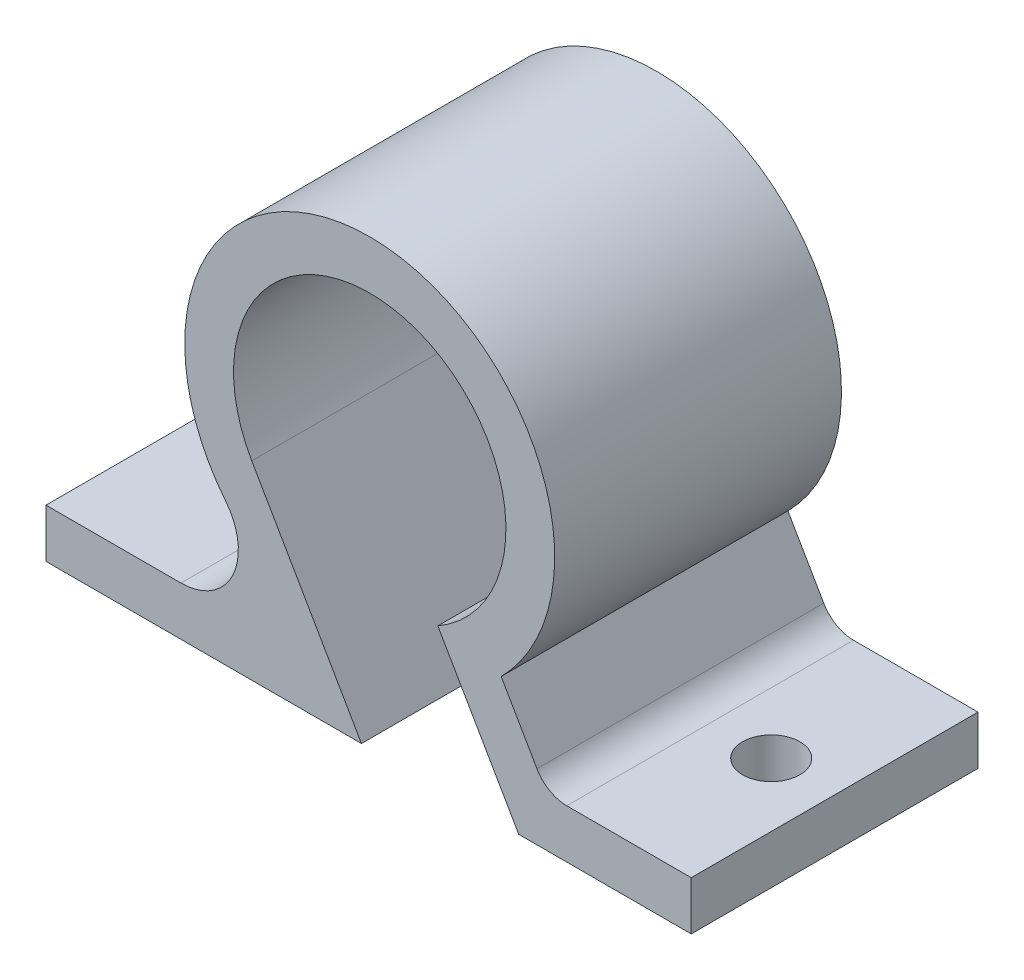
ISO-10303-21;
HEADER;
FILE_DESCRIPTION(('STEP AP214'),'2;1');
FILE_NAME('part.step','',(''),(''),'','','');
FILE_SCHEMA(('AUTOMOTIVE_DESIGN { 1 0 10303 214 1 1 1 1 }'));
ENDSEC;
DATA;
#1=APPLICATION_CONTEXT('core data for automotive mechanical design processes');
#2=APPLICATION_PROTOCOL_DEFINITION('international standard','automotive_design',2000,#1);
#3=PRODUCT_CONTEXT('',#1,'mechanical');
#4=PRODUCT('Part','Part','',(#3));
#5=PRODUCT_RELATED_PRODUCT_CATEGORY('part','',(#4));
#6=PRODUCT_DEFINITION_FORMATION('','',#4);
#7=PRODUCT_DEFINITION_CONTEXT('part definition',#1,'design');
#8=PRODUCT_DEFINITION('design','',#6,#7);
#9=PRODUCT_DEFINITION_SHAPE('','',#8);
#10=(LENGTH_UNIT() NAMED_UNIT(*) SI_UNIT(.MILLI.,.METRE.));
#11=(NAMED_UNIT(*) PLANE_ANGLE_UNIT() SI_UNIT($,.RADIAN.));
#12=(NAMED_UNIT(*) SI_UNIT($,.STERADIAN.) SOLID_ANGLE_UNIT());
#13=UNCERTAINTY_MEASURE_WITH_UNIT(LENGTH_MEASURE(1.E-05),#10,'distance_accuracy_value','');
#14=(GEOMETRIC_REPRESENTATION_CONTEXT(3) GLOBAL_UNCERTAINTY_ASSIGNED_CONTEXT((#13)) GLOBAL_UNIT_ASSIGNED_CONTEXT((#10,
#11,#12)) REPRESENTATION_CONTEXT('',''));
#15=CARTESIAN_POINT('',(0.,0.,0.));
#16=DIRECTION('',(0.,0.,1.));
#17=DIRECTION('',(1.,0.,0.));
#18=AXIS2_PLACEMENT_3D('',#15,#16,#17);
#19=CARTESIAN_POINT('',(-65.8122329054409,-53.,50.));
#20=DIRECTION('',(0.,0.,-1.));
#21=DIRECTION('',(-1.,0.,0.));
#22=AXIS2_PLACEMENT_3D('',#19,#20,#21);
#23=CYLINDRICAL_SURFACE('',#22,20.);
#24=CARTESIAN_POINT('',(-65.8122329054409,-53.,-50.));
#25=DIRECTION('',(0.,0.,-1.));
#26=DIRECTION('',(-1.,0.,0.));
#27=AXIS2_PLACEMENT_3D('',#24,#25,#26);
#28=CIRCLE('',#27,20.);
#29=CARTESIAN_POINT('',(-50.235373046165,-40.4556213017751,-50.));
#30=VERTEX_POINT('',#29);
#31=CARTESIAN_POINT('',(-65.8122329054409,-73.,-50.));
#32=VERTEX_POINT('',#31);
#33=EDGE_CURVE('E161',#30,#32,#28,.T.);
#34=ORIENTED_EDGE('',*,*,#33,.T.);
#35=DIRECTION('',(0.,0.,-1.));
#36=VECTOR('',#35,1.);
#37=CARTESIAN_POINT('',(-65.8122329054409,-73.,50.));
#38=LINE('',#37,#36);
#39=CARTESIAN_POINT('',(-65.8122329054409,-73.,50.));
#40=VERTEX_POINT('',#39);
#41=EDGE_CURVE('E11',#40,#32,#38,.T.);
#42=ORIENTED_EDGE('',*,*,#41,.F.);
#43=CARTESIAN_POINT('',(-65.8122329054409,-53.,50.));
#44=DIRECTION('',(0.,0.,-1.));
#45=DIRECTION('',(-1.,0.,0.));
#46=AXIS2_PLACEMENT_3D('',#43,#44,#45);
#47=CIRCLE('',#46,20.);
#48=CARTESIAN_POINT('',(-50.235373046165,-40.4556213017751,50.));
#49=VERTEX_POINT('',#48);
#50=EDGE_CURVE('E189',#49,#40,#47,.T.);
#51=ORIENTED_EDGE('',*,*,#50,.F.);
#52=DIRECTION('',(0.,0.,-1.));
#53=VECTOR('',#52,1.);
#54=CARTESIAN_POINT('',(-50.235373046165,-40.4556213017751,50.));
#55=LINE('',#54,#53);
#56=EDGE_CURVE('E162',#49,#30,#55,.T.);
#57=ORIENTED_EDGE('',*,*,#56,.T.);
#58=EDGE_LOOP('',(#34,#42,#51,#57));
#59=FACE_BOUND('',#58,.T.);
#60=ADVANCED_FACE('F39',(#59),#23,.F.);
#61=CARTESIAN_POINT('',(-65.8122329054409,-73.,50.));
#62=DIRECTION('',(0.,-1.,0.));
#63=DIRECTION('',(1.,0.,0.));
#64=AXIS2_PLACEMENT_3D('',#61,#62,#63);
#65=PLANE('',#64);
#66=CARTESIAN_POINT('',(-90.,-73.,0.));
#67=DIRECTION('',(0.,-1.,0.));
#68=DIRECTION('',(1.,0.,0.));
#69=AXIS2_PLACEMENT_3D('',#66,#67,#68);
#70=CIRCLE('',#69,9.99999999999999);
#71=CARTESIAN_POINT('',(-90.,-73.,-9.99999999999999));
#72=VERTEX_POINT('',#71);
#73=EDGE_CURVE('E363',#72,#72,#70,.F.);
#74=ORIENTED_EDGE('',*,*,#73,.F.);
#75=EDGE_LOOP('',(#74));
#76=FACE_BOUND('',#75,.T.);
#77=DIRECTION('',(-1.,0.,0.));
#78=VECTOR('',#77,1.);
#79=CARTESIAN_POINT('',(-65.8122329054409,-73.,-50.));
#80=LINE('',#79,#78);
#81=CARTESIAN_POINT('',(-112.886751345948,-73.,-50.));
#82=VERTEX_POINT('',#81);
#83=EDGE_CURVE('E166',#32,#82,#80,.T.);
#84=ORIENTED_EDGE('',*,*,#83,.T.);
#85=DIRECTION('',(0.,0.,-1.));
#86=VECTOR('',#85,1.);
#87=CARTESIAN_POINT('',(-112.886751345948,-73.,50.));
#88=LINE('',#87,#86);
#89=CARTESIAN_POINT('',(-112.886751345948,-73.,50.));
#90=VERTEX_POINT('',#89);
#91=EDGE_CURVE('E50',#90,#82,#88,.T.);
#92=ORIENTED_EDGE('',*,*,#91,.F.);
#93=DIRECTION('',(-1.,0.,0.));
#94=VECTOR('',#93,1.);
#95=CARTESIAN_POINT('',(-65.8122329054409,-73.,50.));
#96=LINE('',#95,#94);
#97=EDGE_CURVE('E111',#40,#90,#96,.T.);
#98=ORIENTED_EDGE('',*,*,#97,.F.);
#99=ORIENTED_EDGE('',*,*,#41,.T.);
#100=EDGE_LOOP('',(#84,#92,#98,#99));
#101=FACE_BOUND('',#100,.T.);
#102=ADVANCED_FACE('F273',(#76,#101),#65,.F.);
#103=CARTESIAN_POINT('',(-112.886751345948,-73.,50.));
#104=DIRECTION('',(1.,0.,0.));
#105=DIRECTION('',(0.,0.,-1.));
#106=AXIS2_PLACEMENT_3D('',#103,#104,#105);
#107=PLANE('',#106);
#108=DIRECTION('',(0.,-1.,0.));
#109=VECTOR('',#108,1.);
#110=CARTESIAN_POINT('',(-112.886751345948,-73.,-50.));
#111=LINE('',#110,#109);
#112=CARTESIAN_POINT('',(-112.886751345948,-90.,-50.));
#113=VERTEX_POINT('',#112);
#114=EDGE_CURVE('E173',#82,#113,#111,.T.);
#115=ORIENTED_EDGE('',*,*,#114,.T.);
#116=DIRECTION('',(0.,0.,-1.));
#117=VECTOR('',#116,1.);
#118=CARTESIAN_POINT('',(-112.886751345948,-90.,50.));
#119=LINE('',#118,#117);
#120=CARTESIAN_POINT('',(-112.886751345948,-90.,50.));
#121=VERTEX_POINT('',#120);
#122=EDGE_CURVE('E212',#121,#113,#119,.T.);
#123=ORIENTED_EDGE('',*,*,#122,.F.);
#124=DIRECTION('',(0.,-1.,0.));
#125=VECTOR('',#124,1.);
#126=CARTESIAN_POINT('',(-112.886751345948,-73.,50.));
#127=LINE('',#126,#125);
#128=EDGE_CURVE('E217',#90,#121,#127,.T.);
#129=ORIENTED_EDGE('',*,*,#128,.F.);
#130=ORIENTED_EDGE('',*,*,#91,.T.);
#131=EDGE_LOOP('',(#115,#123,#129,#130));
#132=FACE_BOUND('',#131,.T.);
#133=ADVANCED_FACE('F216',(#132),#107,.F.);
#134=CARTESIAN_POINT('',(-112.886751345948,-90.,50.));
#135=DIRECTION('',(0.,1.,0.));
#136=DIRECTION('',(0.,0.,1.));
#137=AXIS2_PLACEMENT_3D('',#134,#135,#136);
#138=PLANE('',#137);
#139=CARTESIAN_POINT('',(-90.,-90.,0.));
#140=DIRECTION('',(0.,-1.,0.));
#141=DIRECTION('',(0.,0.,1.));
#142=AXIS2_PLACEMENT_3D('',#139,#140,#141);
#143=CIRCLE('',#142,9.99999999999999);
#144=CARTESIAN_POINT('',(-90.,-90.,-9.99999999999999));
#145=VERTEX_POINT('',#144);
#146=EDGE_CURVE('E361',#145,#145,#143,.T.);
#147=ORIENTED_EDGE('',*,*,#146,.F.);
#148=EDGE_LOOP('',(#147));
#149=FACE_BOUND('',#148,.T.);
#150=DIRECTION('',(1.,0.,0.));
#151=VECTOR('',#150,1.);
#152=CARTESIAN_POINT('',(-112.886751345948,-90.,-50.));
#153=LINE('',#152,#151);
#154=CARTESIAN_POINT('',(-2.88675134594834,-90.,-50.));
#155=VERTEX_POINT('',#154);
#156=EDGE_CURVE('E171',#113,#155,#153,.T.);
#157=ORIENTED_EDGE('',*,*,#156,.T.);
#158=DIRECTION('',(0.,0.,-1.));
#159=VECTOR('',#158,1.);
#160=CARTESIAN_POINT('',(-2.88675134594834,-90.,50.));
#161=LINE('',#160,#159);
#162=CARTESIAN_POINT('',(-2.88675134594834,-90.,50.));
#163=VERTEX_POINT('',#162);
#164=EDGE_CURVE('E209',#163,#155,#161,.T.);
#165=ORIENTED_EDGE('',*,*,#164,.F.);
#166=DIRECTION('',(1.,0.,0.));
#167=VECTOR('',#166,1.);
#168=CARTESIAN_POINT('',(-112.886751345948,-90.,50.));
#169=LINE('',#168,#167);
#170=EDGE_CURVE('E239',#121,#163,#169,.T.);
#171=ORIENTED_EDGE('',*,*,#170,.F.);
#172=ORIENTED_EDGE('',*,*,#122,.T.);
#173=EDGE_LOOP('',(#157,#165,#171,#172));
#174=FACE_BOUND('',#173,.T.);
#175=ADVANCED_FACE('F227',(#149,#174),#138,.F.);
#176=CARTESIAN_POINT('',(-41.1362066797609,-23.7499999999999,50.));
#177=DIRECTION('',(-0.86602540378444,-0.499999999999998,0.));
#178=DIRECTION('',(0.499999999999998,-0.86602540378444,0.));
#179=AXIS2_PLACEMENT_3D('',#176,#177,#178);
#180=PLANE('',#179);
#181=DIRECTION('',(-0.499999999999998,0.86602540378444,0.));
#182=VECTOR('',#181,1.);
#183=CARTESIAN_POINT('',(-41.1362066797609,-23.7499999999999,-50.));
#184=LINE('',#183,#182);
#185=CARTESIAN_POINT('',(-41.1362066797609,-23.7499999999999,-50.));
#186=VERTEX_POINT('',#185);
#187=EDGE_CURVE('E172',#155,#186,#184,.T.);
#188=ORIENTED_EDGE('',*,*,#187,.T.);
#189=DIRECTION('',(0.,0.,-1.));
#190=VECTOR('',#189,1.);
#191=CARTESIAN_POINT('',(-41.1362066797609,-23.7499999999999,50.));
#192=LINE('',#191,#190);
#193=CARTESIAN_POINT('',(-41.1362066797609,-23.7499999999999,50.));
#194=VERTEX_POINT('',#193);
#195=EDGE_CURVE('E207',#194,#186,#192,.T.);
#196=ORIENTED_EDGE('',*,*,#195,.F.);
#197=DIRECTION('',(-0.499999999999998,0.86602540378444,0.));
#198=VECTOR('',#197,1.);
#199=CARTESIAN_POINT('',(-41.1362066797609,-23.7499999999999,50.));
#200=LINE('',#199,#198);
#201=EDGE_CURVE('E234',#163,#194,#200,.T.);
#202=ORIENTED_EDGE('',*,*,#201,.F.);
#203=ORIENTED_EDGE('',*,*,#164,.T.);
#204=EDGE_LOOP('',(#188,#196,#202,#203));
#205=FACE_BOUND('',#204,.T.);
#206=ADVANCED_FACE('F232',(#205),#180,.F.);
#207=CARTESIAN_POINT('',(0.,0.,50.));
#208=DIRECTION('',(0.,0.,-1.));
#209=DIRECTION('',(-1.,0.,0.));
#210=AXIS2_PLACEMENT_3D('',#207,#208,#209);
#211=CYLINDRICAL_SURFACE('',#210,47.5);
#212=CARTESIAN_POINT('',(0.,0.,-50.));
#213=DIRECTION('',(0.,0.,-1.));
#214=DIRECTION('',(1.,0.,0.));
#215=AXIS2_PLACEMENT_3D('',#212,#213,#214);
#216=CIRCLE('',#215,47.5);
#217=CARTESIAN_POINT('',(23.7499999999999,-41.1362066797609,-50.));
#218=VERTEX_POINT('',#217);
#219=EDGE_CURVE('E180',#186,#218,#216,.T.);
#220=ORIENTED_EDGE('',*,*,#219,.T.);
#221=DIRECTION('',(0.,0.,-1.));
#222=VECTOR('',#221,1.);
#223=CARTESIAN_POINT('',(23.7499999999999,-41.1362066797609,50.));
#224=LINE('',#223,#222);
#225=CARTESIAN_POINT('',(23.7499999999999,-41.1362066797609,50.));
#226=VERTEX_POINT('',#225);
#227=EDGE_CURVE('E201',#226,#218,#224,.T.);
#228=ORIENTED_EDGE('',*,*,#227,.F.);
#229=CARTESIAN_POINT('',(0.,0.,50.));
#230=DIRECTION('',(0.,0.,-1.));
#231=DIRECTION('',(1.,0.,0.));
#232=AXIS2_PLACEMENT_3D('',#229,#230,#231);
#233=CIRCLE('',#232,47.5);
#234=EDGE_CURVE('E240',#194,#226,#233,.T.);
#235=ORIENTED_EDGE('',*,*,#234,.F.);
#236=ORIENTED_EDGE('',*,*,#195,.T.);
#237=EDGE_LOOP('',(#220,#228,#235,#236));
#238=FACE_BOUND('',#237,.T.);
#239=ADVANCED_FACE('F286',(#238),#211,.F.);
#240=CARTESIAN_POINT('',(23.7499999999999,-41.1362066797609,50.));
#241=DIRECTION('',(0.86602540378444,0.499999999999998,0.));
#242=DIRECTION('',(-0.499999999999998,0.86602540378444,0.));
#243=AXIS2_PLACEMENT_3D('',#240,#241,#242);
#244=PLANE('',#243);
#245=DIRECTION('',(0.499999999999998,-0.86602540378444,0.));
#246=VECTOR('',#245,1.);
#247=CARTESIAN_POINT('',(23.7499999999999,-41.1362066797609,-50.));
#248=LINE('',#247,#246);
#249=CARTESIAN_POINT('',(51.961524227066,-90.,-50.));
#250=VERTEX_POINT('',#249);
#251=EDGE_CURVE('E177',#218,#250,#248,.T.);
#252=ORIENTED_EDGE('',*,*,#251,.T.);
#253=DIRECTION('',(0.,0.,-1.));
#254=VECTOR('',#253,1.);
#255=CARTESIAN_POINT('',(51.961524227066,-90.,50.));
#256=LINE('',#255,#254);
#257=CARTESIAN_POINT('',(51.961524227066,-90.,50.));
#258=VERTEX_POINT('',#257);
#259=EDGE_CURVE('E196',#258,#250,#256,.T.);
#260=ORIENTED_EDGE('',*,*,#259,.F.);
#261=DIRECTION('',(0.499999999999998,-0.86602540378444,0.));
#262=VECTOR('',#261,1.);
#263=CARTESIAN_POINT('',(23.7499999999999,-41.1362066797609,50.));
#264=LINE('',#263,#262);
#265=EDGE_CURVE('E238',#226,#258,#264,.T.);
#266=ORIENTED_EDGE('',*,*,#265,.F.);
#267=ORIENTED_EDGE('',*,*,#227,.T.);
#268=EDGE_LOOP('',(#252,#260,#266,#267));
#269=FACE_BOUND('',#268,.T.);
#270=ADVANCED_FACE('F291',(#269),#244,.F.);
#271=CARTESIAN_POINT('',(51.961524227066,-90.,50.));
#272=DIRECTION('',(0.,1.,0.));
#273=DIRECTION('',(0.,0.,1.));
#274=AXIS2_PLACEMENT_3D('',#271,#272,#273);
#275=PLANE('',#274);
#276=CARTESIAN_POINT('',(90.,-90.,0.));
#277=DIRECTION('',(0.,-1.,0.));
#278=DIRECTION('',(0.,0.,-1.));
#279=AXIS2_PLACEMENT_3D('',#276,#277,#278);
#280=CIRCLE('',#279,9.99999999999999);
#281=CARTESIAN_POINT('',(90.,-90.,-9.99999999999999));
#282=VERTEX_POINT('',#281);
#283=EDGE_CURVE('E364',#282,#282,#280,.T.);
#284=ORIENTED_EDGE('',*,*,#283,.F.);
#285=EDGE_LOOP('',(#284));
#286=FACE_BOUND('',#285,.T.);
#287=DIRECTION('',(1.,0.,0.));
#288=VECTOR('',#287,1.);
#289=CARTESIAN_POINT('',(51.961524227066,-90.,-50.));
#290=LINE('',#289,#288);
#291=CARTESIAN_POINT('',(112.113248654052,-90.,-50.));
#292=VERTEX_POINT('',#291);
#293=EDGE_CURVE('E181',#250,#292,#290,.T.);
#294=ORIENTED_EDGE('',*,*,#293,.T.);
#295=DIRECTION('',(0.,0.,-1.));
#296=VECTOR('',#295,1.);
#297=CARTESIAN_POINT('',(112.113248654052,-90.,50.));
#298=LINE('',#297,#296);
#299=CARTESIAN_POINT('',(112.113248654052,-90.,50.));
#300=VERTEX_POINT('',#299);
#301=EDGE_CURVE('E200',#300,#292,#298,.T.);
#302=ORIENTED_EDGE('',*,*,#301,.F.);
#303=DIRECTION('',(1.,0.,0.));
#304=VECTOR('',#303,1.);
#305=CARTESIAN_POINT('',(51.961524227066,-90.,50.));
#306=LINE('',#305,#304);
#307=EDGE_CURVE('E247',#258,#300,#306,.T.);
#308=ORIENTED_EDGE('',*,*,#307,.F.);
#309=ORIENTED_EDGE('',*,*,#259,.T.);
#310=EDGE_LOOP('',(#294,#302,#308,#309));
#311=FACE_BOUND('',#310,.T.);
#312=ADVANCED_FACE('F300',(#286,#311),#275,.F.);
#313=CARTESIAN_POINT('',(112.113248654052,-90.,50.));
#314=DIRECTION('',(-1.,0.,0.));
#315=DIRECTION('',(0.,-1.,0.));
#316=AXIS2_PLACEMENT_3D('',#313,#314,#315);
#317=PLANE('',#316);
#318=DIRECTION('',(0.,1.,0.));
#319=VECTOR('',#318,1.);
#320=CARTESIAN_POINT('',(112.113248654052,-90.,-50.));
#321=LINE('',#320,#319);
#322=CARTESIAN_POINT('',(112.113248654052,-73.,-50.));
#323=VERTEX_POINT('',#322);
#324=EDGE_CURVE('E183',#292,#323,#321,.T.);
#325=ORIENTED_EDGE('',*,*,#324,.T.);
#326=DIRECTION('',(0.,0.,-1.));
#327=VECTOR('',#326,1.);
#328=CARTESIAN_POINT('',(112.113248654052,-73.,50.));
#329=LINE('',#328,#327);
#330=CARTESIAN_POINT('',(112.113248654052,-73.,50.));
#331=VERTEX_POINT('',#330);
#332=EDGE_CURVE('E191',#331,#323,#329,.T.);
#333=ORIENTED_EDGE('',*,*,#332,.F.);
#334=DIRECTION('',(0.,1.,0.));
#335=VECTOR('',#334,1.);
#336=CARTESIAN_POINT('',(112.113248654052,-90.,50.));
#337=LINE('',#336,#335);
#338=EDGE_CURVE('E246',#300,#331,#337,.T.);
#339=ORIENTED_EDGE('',*,*,#338,.F.);
#340=ORIENTED_EDGE('',*,*,#301,.T.);
#341=EDGE_LOOP('',(#325,#333,#339,#340));
#342=FACE_BOUND('',#341,.T.);
#343=ADVANCED_FACE('F254',(#342),#317,.F.);
#344=CARTESIAN_POINT('',(112.113248654052,-73.,50.));
#345=DIRECTION('',(0.,-1.,0.));
#346=DIRECTION('',(1.,0.,0.));
#347=AXIS2_PLACEMENT_3D('',#344,#345,#346);
#348=PLANE('',#347);
#349=CARTESIAN_POINT('',(90.,-73.,0.));
#350=DIRECTION('',(0.,-1.,0.));
#351=DIRECTION('',(1.,0.,0.));
#352=AXIS2_PLACEMENT_3D('',#349,#350,#351);
#353=CIRCLE('',#352,9.99999999999999);
#354=CARTESIAN_POINT('',(90.,-73.,-9.99999999999999));
#355=VERTEX_POINT('',#354);
#356=EDGE_CURVE('E170',#355,#355,#353,.F.);
#357=ORIENTED_EDGE('',*,*,#356,.F.);
#358=EDGE_LOOP('',(#357));
#359=FACE_BOUND('',#358,.T.);
#360=DIRECTION('',(-1.,0.,0.));
#361=VECTOR('',#360,1.);
#362=CARTESIAN_POINT('',(112.113248654052,-73.,-50.));
#363=LINE('',#362,#361);
#364=CARTESIAN_POINT('',(68.7046820335653,-73.,-50.));
#365=VERTEX_POINT('',#364);
#366=EDGE_CURVE('E184',#323,#365,#363,.T.);
#367=ORIENTED_EDGE('',*,*,#366,.T.);
#368=DIRECTION('',(0.,0.,-1.));
#369=VECTOR('',#368,1.);
#370=CARTESIAN_POINT('',(68.7046820335653,-73.,50.));
#371=LINE('',#370,#369);
#372=CARTESIAN_POINT('',(68.7046820335653,-73.,50.));
#373=VERTEX_POINT('',#372);
#374=EDGE_CURVE('E157',#373,#365,#371,.T.);
#375=ORIENTED_EDGE('',*,*,#374,.F.);
#376=DIRECTION('',(-1.,0.,0.));
#377=VECTOR('',#376,1.);
#378=CARTESIAN_POINT('',(112.113248654052,-73.,50.));
#379=LINE('',#378,#377);
#380=EDGE_CURVE('E150',#331,#373,#379,.T.);
#381=ORIENTED_EDGE('',*,*,#380,.F.);
#382=ORIENTED_EDGE('',*,*,#332,.T.);
#383=EDGE_LOOP('',(#367,#375,#381,#382));
#384=FACE_BOUND('',#383,.T.);
#385=ADVANCED_FACE('F256',(#359,#384),#348,.F.);
#386=CARTESIAN_POINT('',(68.7046820335653,-61.,50.));
#387=DIRECTION('',(0.,0.,-1.));
#388=DIRECTION('',(-1.,0.,0.));
#389=AXIS2_PLACEMENT_3D('',#386,#387,#388);
#390=CYLINDRICAL_SURFACE('',#389,12.);
#391=CARTESIAN_POINT('',(68.7046820335653,-61.,-50.));
#392=DIRECTION('',(0.,0.,-1.));
#393=DIRECTION('',(-1.,0.,0.));
#394=AXIS2_PLACEMENT_3D('',#391,#392,#393);
#395=CIRCLE('',#394,12.);
#396=CARTESIAN_POINT('',(58.312377188152,-67.,-50.));
#397=VERTEX_POINT('',#396);
#398=EDGE_CURVE('E151',#365,#397,#395,.T.);
#399=ORIENTED_EDGE('',*,*,#398,.T.);
#400=DIRECTION('',(0.,0.,-1.));
#401=VECTOR('',#400,1.);
#402=CARTESIAN_POINT('',(58.312377188152,-67.,50.));
#403=LINE('',#402,#401);
#404=CARTESIAN_POINT('',(58.312377188152,-67.,50.));
#405=VERTEX_POINT('',#404);
#406=EDGE_CURVE('E155',#405,#397,#403,.T.);
#407=ORIENTED_EDGE('',*,*,#406,.F.);
#408=CARTESIAN_POINT('',(68.7046820335653,-61.,50.));
#409=DIRECTION('',(0.,0.,-1.));
#410=DIRECTION('',(-1.,0.,0.));
#411=AXIS2_PLACEMENT_3D('',#408,#409,#410);
#412=CIRCLE('',#411,12.);
#413=EDGE_CURVE('E141',#373,#405,#412,.T.);
#414=ORIENTED_EDGE('',*,*,#413,.F.);
#415=ORIENTED_EDGE('',*,*,#374,.T.);
#416=EDGE_LOOP('',(#399,#407,#414,#415));
#417=FACE_BOUND('',#416,.T.);
#418=ADVANCED_FACE('F153',(#417),#390,.F.);
#419=CARTESIAN_POINT('',(58.312377188152,-67.,50.));
#420=DIRECTION('',(-0.866025403784439,-0.499999999999998,0.));
#421=DIRECTION('',(0.499999999999999,-0.86602540378444,0.));
#422=AXIS2_PLACEMENT_3D('',#419,#420,#421);
#423=PLANE('',#422);
#424=DIRECTION('',(-0.499999999999998,0.866025403784439,0.));
#425=VECTOR('',#424,1.);
#426=CARTESIAN_POINT('',(58.312377188152,-67.,-50.));
#427=LINE('',#426,#425);
#428=CARTESIAN_POINT('',(45.8321168514901,-45.3835550052148,-50.));
#429=VERTEX_POINT('',#428);
#430=EDGE_CURVE('E98',#397,#429,#427,.T.);
#431=ORIENTED_EDGE('',*,*,#430,.T.);
#432=DIRECTION('',(0.,0.,-1.));
#433=VECTOR('',#432,1.);
#434=CARTESIAN_POINT('',(45.8321168514901,-45.3835550052148,50.));
#435=LINE('',#434,#433);
#436=CARTESIAN_POINT('',(45.8321168514901,-45.3835550052148,50.));
#437=VERTEX_POINT('',#436);
#438=EDGE_CURVE('E160',#437,#429,#435,.T.);
#439=ORIENTED_EDGE('',*,*,#438,.F.);
#440=DIRECTION('',(-0.499999999999998,0.866025403784439,0.));
#441=VECTOR('',#440,1.);
#442=CARTESIAN_POINT('',(58.312377188152,-67.,50.));
#443=LINE('',#442,#441);
#444=EDGE_CURVE('E144',#405,#437,#443,.T.);
#445=ORIENTED_EDGE('',*,*,#444,.F.);
#446=ORIENTED_EDGE('',*,*,#406,.T.);
#447=EDGE_LOOP('',(#431,#439,#445,#446));
#448=FACE_BOUND('',#447,.T.);
#449=ADVANCED_FACE('F159',(#448),#423,.F.);
#450=CARTESIAN_POINT('',(0.,0.,50.));
#451=DIRECTION('',(0.,0.,-1.));
#452=DIRECTION('',(-1.,0.,0.));
#453=AXIS2_PLACEMENT_3D('',#450,#451,#452);
#454=CYLINDRICAL_SURFACE('',#453,64.5);
#455=CARTESIAN_POINT('',(0.,0.,-50.));
#456=DIRECTION('',(0.,0.,1.));
#457=DIRECTION('',(1.,0.,0.));
#458=AXIS2_PLACEMENT_3D('',#455,#456,#457);
#459=CIRCLE('',#458,64.5);
#460=EDGE_CURVE('E103',#429,#30,#459,.T.);
#461=ORIENTED_EDGE('',*,*,#460,.T.);
#462=ORIENTED_EDGE('',*,*,#56,.F.);
#463=CARTESIAN_POINT('',(0.,0.,50.));
#464=DIRECTION('',(0.,0.,1.));
#465=DIRECTION('',(1.,0.,0.));
#466=AXIS2_PLACEMENT_3D('',#463,#464,#465);
#467=CIRCLE('',#466,64.5);
#468=EDGE_CURVE('E54',#437,#49,#467,.T.);
#469=ORIENTED_EDGE('',*,*,#468,.F.);
#470=ORIENTED_EDGE('',*,*,#438,.T.);
#471=EDGE_LOOP('',(#461,#462,#469,#470));
#472=FACE_BOUND('',#471,.T.);
#473=ADVANCED_FACE('F265',(#472),#454,.T.);
#474=CARTESIAN_POINT('',(-65.8122329054409,-53.,50.));
#475=DIRECTION('',(0.,0.,-1.));
#476=DIRECTION('',(-1.,0.,0.));
#477=AXIS2_PLACEMENT_3D('',#474,#475,#476);
#478=PLANE('',#477);
#479=ORIENTED_EDGE('',*,*,#50,.T.);
#480=ORIENTED_EDGE('',*,*,#97,.T.);
#481=ORIENTED_EDGE('',*,*,#128,.T.);
#482=ORIENTED_EDGE('',*,*,#170,.T.);
#483=ORIENTED_EDGE('',*,*,#201,.T.);
#484=ORIENTED_EDGE('',*,*,#234,.T.);
#485=ORIENTED_EDGE('',*,*,#265,.T.);
#486=ORIENTED_EDGE('',*,*,#307,.T.);
#487=ORIENTED_EDGE('',*,*,#338,.T.);
#488=ORIENTED_EDGE('',*,*,#380,.T.);
#489=ORIENTED_EDGE('',*,*,#413,.T.);
#490=ORIENTED_EDGE('',*,*,#444,.T.);
#491=ORIENTED_EDGE('',*,*,#468,.T.);
#492=EDGE_LOOP('',(#479,#480,#481,#482,#483,#484,#485,#486,#487,#488,#489,#490,#491));
#493=FACE_BOUND('',#492,.T.);
#494=ADVANCED_FACE('F142',(#493),#478,.F.);
#495=CARTESIAN_POINT('',(-65.8122329054409,-53.,-50.));
#496=DIRECTION('',(0.,0.,-1.));
#497=DIRECTION('',(-1.,0.,0.));
#498=AXIS2_PLACEMENT_3D('',#495,#496,#497);
#499=PLANE('',#498);
#500=ORIENTED_EDGE('',*,*,#33,.F.);
#501=ORIENTED_EDGE('',*,*,#460,.F.);
#502=ORIENTED_EDGE('',*,*,#430,.F.);
#503=ORIENTED_EDGE('',*,*,#398,.F.);
#504=ORIENTED_EDGE('',*,*,#366,.F.);
#505=ORIENTED_EDGE('',*,*,#324,.F.);
#506=ORIENTED_EDGE('',*,*,#293,.F.);
#507=ORIENTED_EDGE('',*,*,#251,.F.);
#508=ORIENTED_EDGE('',*,*,#219,.F.);
#509=ORIENTED_EDGE('',*,*,#187,.F.);
#510=ORIENTED_EDGE('',*,*,#156,.F.);
#511=ORIENTED_EDGE('',*,*,#114,.F.);
#512=ORIENTED_EDGE('',*,*,#83,.F.);
#513=EDGE_LOOP('',(#500,#501,#502,#503,#504,#505,#506,#507,#508,#509,#510,#511,#512));
#514=FACE_BOUND('',#513,.T.);
#515=ADVANCED_FACE('F222',(#514),#499,.T.);
#516=CARTESIAN_POINT('',(90.,64.501,0.));
#517=DIRECTION('',(0.,-1.,0.));
#518=DIRECTION('',(0.,0.,-1.));
#519=AXIS2_PLACEMENT_3D('',#516,#517,#518);
#520=CYLINDRICAL_SURFACE('',#519,9.99999999999999);
#521=CARTESIAN_POINT('',(90.,-90.,-9.99999999999999));
#522=CARTESIAN_POINT('',(90.,-89.8229166666666,-9.99999999999999));
#523=CARTESIAN_POINT('',(90.,-89.6458333333333,-9.99999999999999));
#524=CARTESIAN_POINT('',(90.,-89.2916666666666,-9.99999999999999));
#525=CARTESIAN_POINT('',(90.,-89.1145833333333,-9.99999999999999));
#526=CARTESIAN_POINT('',(90.,-88.7604166666666,-9.99999999999999));
#527=CARTESIAN_POINT('',(90.,-88.5833333333333,-9.99999999999999));
#528=CARTESIAN_POINT('',(90.,-88.2291666666666,-9.99999999999999));
#529=CARTESIAN_POINT('',(90.,-88.0520833333333,-9.99999999999999));
#530=CARTESIAN_POINT('',(90.,-87.6979166666666,-9.99999999999999));
#531=CARTESIAN_POINT('',(90.,-87.5208333333333,-9.99999999999999));
#532=CARTESIAN_POINT('',(90.,-87.1666666666666,-9.99999999999999));
#533=CARTESIAN_POINT('',(90.,-86.9895833333333,-9.99999999999999));
#534=CARTESIAN_POINT('',(90.,-86.6354166666666,-9.99999999999999));
#535=CARTESIAN_POINT('',(90.,-86.4583333333333,-9.99999999999999));
#536=CARTESIAN_POINT('',(90.,-86.1041666666666,-9.99999999999999));
#537=CARTESIAN_POINT('',(90.,-85.9270833333333,-9.99999999999999));
#538=CARTESIAN_POINT('',(90.,-85.5729166666666,-9.99999999999999));
#539=CARTESIAN_POINT('',(90.,-85.3958333333333,-9.99999999999999));
#540=CARTESIAN_POINT('',(90.,-85.0416666666666,-9.99999999999999));
#541=CARTESIAN_POINT('',(90.,-84.8645833333333,-9.99999999999999));
#542=CARTESIAN_POINT('',(90.,-84.5104166666666,-9.99999999999999));
#543=CARTESIAN_POINT('',(90.,-84.3333333333333,-9.99999999999999));
#544=CARTESIAN_POINT('',(90.,-83.9791666666666,-9.99999999999999));
#545=CARTESIAN_POINT('',(90.,-83.8020833333333,-9.99999999999999));
#546=CARTESIAN_POINT('',(90.,-83.4479166666666,-9.99999999999999));
#547=CARTESIAN_POINT('',(90.,-83.2708333333333,-9.99999999999999));
#548=CARTESIAN_POINT('',(90.,-82.9166666666666,-9.99999999999999));
#549=CARTESIAN_POINT('',(90.,-82.7395833333333,-9.99999999999999));
#550=CARTESIAN_POINT('',(90.,-82.3854166666666,-9.99999999999999));
#551=CARTESIAN_POINT('',(90.,-82.2083333333333,-9.99999999999999));
#552=CARTESIAN_POINT('',(90.,-81.8541666666666,-9.99999999999999));
#553=CARTESIAN_POINT('',(90.,-81.6770833333333,-9.99999999999999));
#554=CARTESIAN_POINT('',(90.,-81.3229166666666,-9.99999999999999));
#555=CARTESIAN_POINT('',(90.,-81.1458333333333,-9.99999999999999));
#556=CARTESIAN_POINT('',(90.,-80.7916666666666,-9.99999999999999));
#557=CARTESIAN_POINT('',(90.,-80.6145833333333,-9.99999999999999));
#558=CARTESIAN_POINT('',(90.,-80.2604166666666,-9.99999999999999));
#559=CARTESIAN_POINT('',(90.,-80.0833333333333,-9.99999999999999));
#560=CARTESIAN_POINT('',(90.,-79.7291666666666,-9.99999999999999));
#561=CARTESIAN_POINT('',(90.,-79.5520833333333,-9.99999999999999));
#562=CARTESIAN_POINT('',(90.,-79.1979166666666,-9.99999999999999));
#563=CARTESIAN_POINT('',(90.,-79.0208333333333,-9.99999999999999));
#564=CARTESIAN_POINT('',(90.,-78.6666666666666,-9.99999999999999));
#565=CARTESIAN_POINT('',(90.,-78.4895833333333,-9.99999999999999));
#566=CARTESIAN_POINT('',(90.,-78.1354166666666,-9.99999999999999));
#567=CARTESIAN_POINT('',(90.,-77.9583333333333,-9.99999999999999));
#568=CARTESIAN_POINT('',(90.,-77.6041666666666,-9.99999999999999));
#569=CARTESIAN_POINT('',(90.,-77.4270833333333,-9.99999999999999));
#570=CARTESIAN_POINT('',(90.,-77.0729166666666,-9.99999999999999));
#571=CARTESIAN_POINT('',(90.,-76.8958333333333,-9.99999999999999));
#572=CARTESIAN_POINT('',(90.,-76.5416666666666,-9.99999999999999));
#573=CARTESIAN_POINT('',(90.,-76.3645833333333,-9.99999999999999));
#574=CARTESIAN_POINT('',(90.,-76.0104166666666,-9.99999999999999));
#575=CARTESIAN_POINT('',(90.,-75.8333333333333,-9.99999999999999));
#576=CARTESIAN_POINT('',(90.,-75.4791666666666,-9.99999999999999));
#577=CARTESIAN_POINT('',(90.,-75.3020833333333,-9.99999999999999));
#578=CARTESIAN_POINT('',(90.,-74.9479166666666,-9.99999999999999));
#579=CARTESIAN_POINT('',(90.,-74.7708333333333,-9.99999999999999));
#580=CARTESIAN_POINT('',(90.,-74.4166666666666,-9.99999999999999));
#581=CARTESIAN_POINT('',(90.,-74.2395833333333,-9.99999999999999));
#582=CARTESIAN_POINT('',(90.,-73.8854166666666,-9.99999999999999));
#583=CARTESIAN_POINT('',(90.,-73.7083333333333,-9.99999999999999));
#584=CARTESIAN_POINT('',(90.,-73.3541666666666,-9.99999999999999));
#585=CARTESIAN_POINT('',(90.,-73.1770833333333,-9.99999999999999));
#586=CARTESIAN_POINT('',(90.,-73.,-9.99999999999999));
#587=B_SPLINE_CURVE_WITH_KNOTS('',3,(#521,#522,#523,#524,#525,#526,#527,#528,#529,#530,#531,
#532,#533,#534,#535,#536,#537,#538,#539,#540,#541,#542,#543,#544,#545,#546,#547,#548,#549,#550,
#551,#552,#553,#554,#555,#556,#557,#558,#559,#560,#561,#562,#563,#564,#565,#566,#567,#568,#569,
#570,#571,#572,#573,#574,#575,#576,#577,#578,#579,#580,#581,#582,#583,#584,#585,#586),
.UNSPECIFIED.,.F.,.F.,(4,2,2,2,2,2,2,2,2,2,2,2,2,2,2,2,2,2,2,2,2,2,2,2,2,2,2,2,2,2,2,2,4),(0.,
0.531250000000011,1.06249999999999,1.59375,2.12499999999999,2.65625,3.18750000000001,
3.71874999999999,4.25,4.78125000000001,5.3125,5.84375000000001,6.37500000000002,6.90625,
7.43750000000001,7.96875,8.50000000000001,9.03125000000002,9.5625,10.09375,10.625,11.15625,
11.6875,12.21875,12.75,13.28125,13.8125,14.34375,14.875,15.40625,15.9375,16.46875,17.),.UNSPECIFIED.);
#588=EDGE_CURVE('BSEAM340',#282,#355,#587,.T.);
#589=ORIENTED_EDGE('',*,*,#283,.T.);
#590=ORIENTED_EDGE('',*,*,#356,.T.);
#591=ORIENTED_EDGE('',*,*,#588,.T.);
#592=ORIENTED_EDGE('',*,*,#588,.F.);
#593=EDGE_LOOP('',(#589,#591,#590,#592));
#594=FACE_BOUND('',#593,.T.);
#595=ADVANCED_FACE('F340',(#594),#520,.F.);
#596=CARTESIAN_POINT('',(-90.,64.501,0.));
#597=DIRECTION('',(0.,-1.,0.));
#598=DIRECTION('',(0.,0.,-1.));
#599=AXIS2_PLACEMENT_3D('',#596,#597,#598);
#600=CYLINDRICAL_SURFACE('',#599,9.99999999999999);
#601=CARTESIAN_POINT('',(-90.,-90.,-9.99999999999999));
#602=CARTESIAN_POINT('',(-90.,-89.8229166666666,-9.99999999999999));
#603=CARTESIAN_POINT('',(-90.,-89.6458333333333,-9.99999999999999));
#604=CARTESIAN_POINT('',(-90.,-89.2916666666666,-9.99999999999999));
#605=CARTESIAN_POINT('',(-90.,-89.1145833333333,-9.99999999999999));
#606=CARTESIAN_POINT('',(-90.,-88.7604166666666,-9.99999999999999));
#607=CARTESIAN_POINT('',(-90.,-88.5833333333333,-9.99999999999999));
#608=CARTESIAN_POINT('',(-90.,-88.2291666666666,-9.99999999999999));
#609=CARTESIAN_POINT('',(-90.,-88.0520833333333,-9.99999999999999));
#610=CARTESIAN_POINT('',(-90.,-87.6979166666666,-9.99999999999999));
#611=CARTESIAN_POINT('',(-90.,-87.5208333333333,-9.99999999999999));
#612=CARTESIAN_POINT('',(-90.,-87.1666666666666,-9.99999999999999));
#613=CARTESIAN_POINT('',(-90.,-86.9895833333333,-9.99999999999999));
#614=CARTESIAN_POINT('',(-90.,-86.6354166666666,-9.99999999999999));
#615=CARTESIAN_POINT('',(-90.,-86.4583333333333,-9.99999999999999));
#616=CARTESIAN_POINT('',(-90.,-86.1041666666666,-9.99999999999999));
#617=CARTESIAN_POINT('',(-90.,-85.9270833333333,-9.99999999999999));
#618=CARTESIAN_POINT('',(-90.,-85.5729166666667,-9.99999999999999));
#619=CARTESIAN_POINT('',(-90.,-85.3958333333333,-9.99999999999999));
#620=CARTESIAN_POINT('',(-90.,-85.0416666666666,-9.99999999999999));
#621=CARTESIAN_POINT('',(-90.,-84.8645833333333,-9.99999999999999));
#622=CARTESIAN_POINT('',(-90.,-84.5104166666666,-9.99999999999999));
#623=CARTESIAN_POINT('',(-90.,-84.3333333333333,-9.99999999999999));
#624=CARTESIAN_POINT('',(-90.,-83.9791666666666,-9.99999999999999));
#625=CARTESIAN_POINT('',(-90.,-83.8020833333333,-9.99999999999999));
#626=CARTESIAN_POINT('',(-90.,-83.4479166666666,-9.99999999999999));
#627=CARTESIAN_POINT('',(-90.,-83.2708333333333,-9.99999999999999));
#628=CARTESIAN_POINT('',(-90.,-82.9166666666667,-9.99999999999999));
#629=CARTESIAN_POINT('',(-90.,-82.7395833333333,-9.99999999999999));
#630=CARTESIAN_POINT('',(-90.,-82.3854166666667,-9.99999999999999));
#631=CARTESIAN_POINT('',(-90.,-82.2083333333333,-9.99999999999999));
#632=CARTESIAN_POINT('',(-90.,-81.8541666666667,-9.99999999999999));
#633=CARTESIAN_POINT('',(-90.,-81.6770833333333,-9.99999999999999));
#634=CARTESIAN_POINT('',(-90.,-81.3229166666666,-9.99999999999999));
#635=CARTESIAN_POINT('',(-90.,-81.1458333333333,-9.99999999999999));
#636=CARTESIAN_POINT('',(-90.,-80.7916666666667,-9.99999999999999));
#637=CARTESIAN_POINT('',(-90.,-80.6145833333333,-9.99999999999999));
#638=CARTESIAN_POINT('',(-90.,-80.2604166666667,-9.99999999999999));
#639=CARTESIAN_POINT('',(-90.,-80.0833333333333,-9.99999999999999));
#640=CARTESIAN_POINT('',(-90.,-79.7291666666667,-9.99999999999999));
#641=CARTESIAN_POINT('',(-90.,-79.5520833333333,-9.99999999999999));
#642=CARTESIAN_POINT('',(-90.,-79.1979166666667,-9.99999999999999));
#643=CARTESIAN_POINT('',(-90.,-79.0208333333333,-9.99999999999999));
#644=CARTESIAN_POINT('',(-90.,-78.6666666666667,-9.99999999999999));
#645=CARTESIAN_POINT('',(-90.,-78.4895833333333,-9.99999999999999));
#646=CARTESIAN_POINT('',(-90.,-78.1354166666667,-9.99999999999999));
#647=CARTESIAN_POINT('',(-90.,-77.9583333333333,-9.99999999999999));
#648=CARTESIAN_POINT('',(-90.,-77.6041666666667,-9.99999999999999));
#649=CARTESIAN_POINT('',(-90.,-77.4270833333333,-9.99999999999999));
#650=CARTESIAN_POINT('',(-90.,-77.0729166666667,-9.99999999999999));
#651=CARTESIAN_POINT('',(-90.,-76.8958333333333,-9.99999999999999));
#652=CARTESIAN_POINT('',(-90.,-76.5416666666667,-9.99999999999999));
#653=CARTESIAN_POINT('',(-90.,-76.3645833333333,-9.99999999999999));
#654=CARTESIAN_POINT('',(-90.,-76.0104166666667,-9.99999999999999));
#655=CARTESIAN_POINT('',(-90.,-75.8333333333333,-9.99999999999999));
#656=CARTESIAN_POINT('',(-90.,-75.4791666666667,-9.99999999999999));
#657=CARTESIAN_POINT('',(-90.,-75.3020833333333,-9.99999999999999));
#658=CARTESIAN_POINT('',(-90.,-74.9479166666667,-9.99999999999999));
#659=CARTESIAN_POINT('',(-90.,-74.7708333333333,-9.99999999999999));
#660=CARTESIAN_POINT('',(-90.,-74.4166666666667,-9.99999999999999));
#661=CARTESIAN_POINT('',(-90.,-74.2395833333333,-9.99999999999999));
#662=CARTESIAN_POINT('',(-90.,-73.8854166666667,-9.99999999999999));
#663=CARTESIAN_POINT('',(-90.,-73.7083333333333,-9.99999999999999));
#664=CARTESIAN_POINT('',(-90.,-73.3541666666667,-9.99999999999999));
#665=CARTESIAN_POINT('',(-90.,-73.1770833333333,-9.99999999999999));
#666=CARTESIAN_POINT('',(-90.,-73.,-9.99999999999999));
#667=B_SPLINE_CURVE_WITH_KNOTS('',3,(#601,#602,#603,#604,#605,#606,#607,#608,#609,#610,#611,
#612,#613,#614,#615,#616,#617,#618,#619,#620,#621,#622,#623,#624,#625,#626,#627,#628,#629,#630,
#631,#632,#633,#634,#635,#636,#637,#638,#639,#640,#641,#642,#643,#644,#645,#646,#647,#648,#649,
#650,#651,#652,#653,#654,#655,#656,#657,#658,#659,#660,#661,#662,#663,#664,#665,#666),
.UNSPECIFIED.,.F.,.F.,(4,2,2,2,2,2,2,2,2,2,2,2,2,2,2,2,2,2,2,2,2,2,2,2,2,2,2,2,2,2,2,2,4),(0.,
0.531250000000011,1.06249999999999,1.59375,2.12499999999999,2.65625,3.18749999999998,
3.71874999999999,4.24999999999998,4.78124999999999,5.3125,5.84374999999998,6.37499999999999,
6.90624999999998,7.43749999999999,7.96874999999997,8.49999999999998,9.03124999999999,
9.56249999999997,10.09375,10.625,11.15625,11.6875,12.21875,12.75,13.28125,13.8125,14.34375,
14.875,15.40625,15.9375,16.46875,17.),.UNSPECIFIED.);
#668=EDGE_CURVE('BSEAM341',#145,#72,#667,.T.);
#669=ORIENTED_EDGE('',*,*,#146,.T.);
#670=ORIENTED_EDGE('',*,*,#73,.T.);
#671=ORIENTED_EDGE('',*,*,#668,.T.);
#672=ORIENTED_EDGE('',*,*,#668,.F.);
#673=EDGE_LOOP('',(#669,#671,#670,#672));
#674=FACE_BOUND('',#673,.T.);
#675=ADVANCED_FACE('F341',(#674),#600,.F.);
#676=CLOSED_SHELL('',(#60,#102,#133,#175,#206,#239,#270,#312,#343,#385,#418,#449,#473,#494,#515,
#595,#675));
#677=MANIFOLD_SOLID_BREP('B2',#676);
#678=ADVANCED_BREP_SHAPE_REPRESENTATION('',(#18,#677),#14);
#679=SHAPE_DEFINITION_REPRESENTATION(#9,#678);
ENDSEC;
END-ISO-10303-21;
